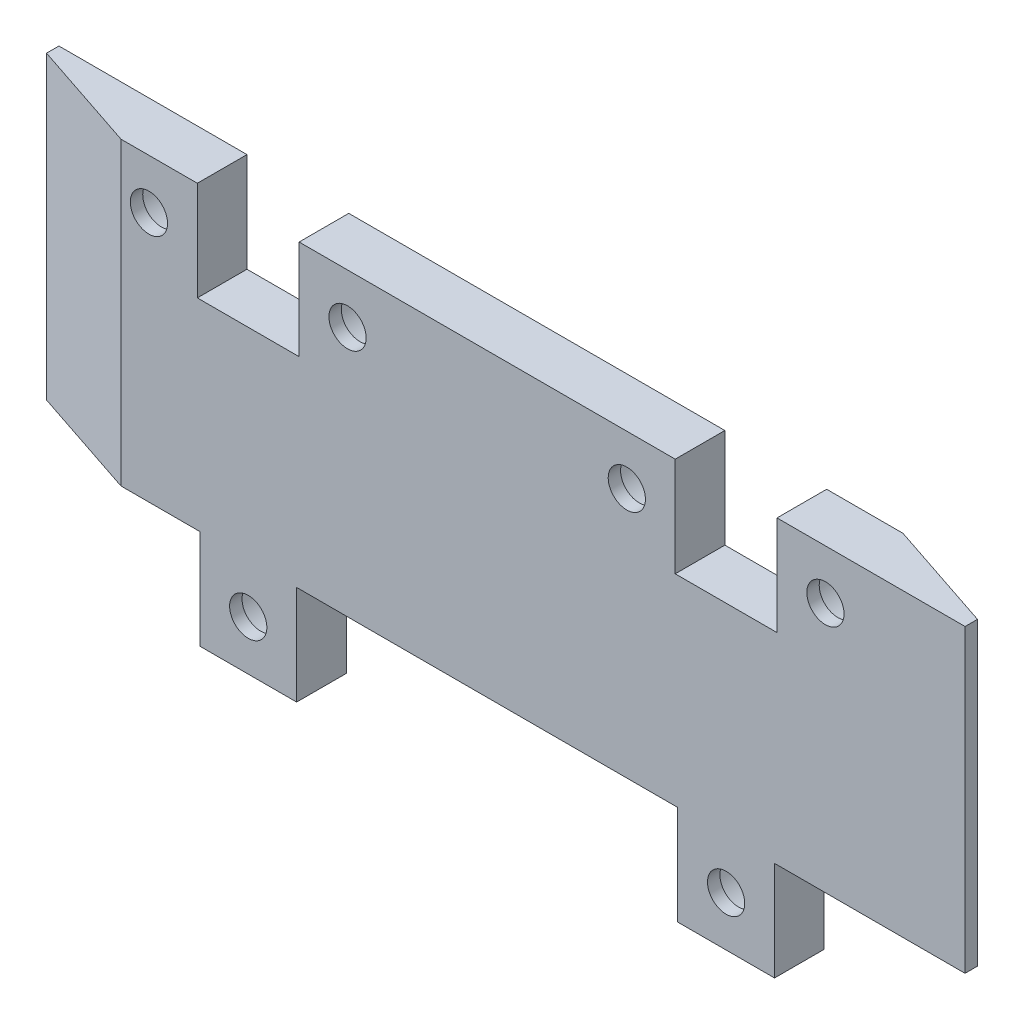
ISO-10303-21;
HEADER;
FILE_DESCRIPTION(('STEP AP214'),'2;1');
FILE_NAME('part.step','',(''),(''),'','','');
FILE_SCHEMA(('AUTOMOTIVE_DESIGN { 1 0 10303 214 1 1 1 1 }'));
ENDSEC;
DATA;
#1=APPLICATION_CONTEXT('core data for automotive mechanical design processes');
#2=APPLICATION_PROTOCOL_DEFINITION('international standard','automotive_design',2000,#1);
#3=PRODUCT_CONTEXT('',#1,'mechanical');
#4=PRODUCT('Part','Part','',(#3));
#5=PRODUCT_RELATED_PRODUCT_CATEGORY('part','',(#4));
#6=PRODUCT_DEFINITION_FORMATION('','',#4);
#7=PRODUCT_DEFINITION_CONTEXT('part definition',#1,'design');
#8=PRODUCT_DEFINITION('design','',#6,#7);
#9=PRODUCT_DEFINITION_SHAPE('','',#8);
#10=(LENGTH_UNIT() NAMED_UNIT(*) SI_UNIT(.MILLI.,.METRE.));
#11=(NAMED_UNIT(*) PLANE_ANGLE_UNIT() SI_UNIT($,.RADIAN.));
#12=(NAMED_UNIT(*) SI_UNIT($,.STERADIAN.) SOLID_ANGLE_UNIT());
#13=UNCERTAINTY_MEASURE_WITH_UNIT(LENGTH_MEASURE(1.E-05),#10,'distance_accuracy_value','');
#14=(GEOMETRIC_REPRESENTATION_CONTEXT(3) GLOBAL_UNCERTAINTY_ASSIGNED_CONTEXT((#13)) GLOBAL_UNIT_ASSIGNED_CONTEXT((#10,
#11,#12)) REPRESENTATION_CONTEXT('',''));
#15=CARTESIAN_POINT('',(0.,0.,0.));
#16=DIRECTION('',(0.,0.,1.));
#17=DIRECTION('',(1.,0.,0.));
#18=AXIS2_PLACEMENT_3D('',#15,#16,#17);
#19=CARTESIAN_POINT('',(-38.5,16.1,4.));
#20=DIRECTION('',(0.,-1.,0.));
#21=DIRECTION('',(0.,0.,-1.));
#22=AXIS2_PLACEMENT_3D('',#19,#20,#21);
#23=PLANE('',#22);
#24=DIRECTION('',(0.,0.,-1.));
#25=VECTOR('',#24,1.);
#26=CARTESIAN_POINT('',(15.15,16.1,10.));
#27=LINE('',#26,#25);
#28=CARTESIAN_POINT('',(15.15,16.1,4.));
#29=VERTEX_POINT('',#28);
#30=CARTESIAN_POINT('',(15.15,16.1,0.));
#31=VERTEX_POINT('',#30);
#32=EDGE_CURVE('E528',#29,#31,#27,.T.);
#33=ORIENTED_EDGE('',*,*,#32,.T.);
#34=DIRECTION('',(-1.,0.,0.));
#35=VECTOR('',#34,1.);
#36=CARTESIAN_POINT('',(-38.5,16.1,0.));
#37=LINE('',#36,#35);
#38=CARTESIAN_POINT('',(-15.15,16.1,0.));
#39=VERTEX_POINT('',#38);
#40=EDGE_CURVE('E476',#31,#39,#37,.T.);
#41=ORIENTED_EDGE('',*,*,#40,.T.);
#42=DIRECTION('',(0.,0.,-1.));
#43=VECTOR('',#42,1.);
#44=CARTESIAN_POINT('',(-15.15,16.0999999999999,10.));
#45=LINE('',#44,#43);
#46=CARTESIAN_POINT('',(-15.15,16.0999999999999,4.));
#47=VERTEX_POINT('',#46);
#48=EDGE_CURVE('E331',#47,#39,#45,.T.);
#49=ORIENTED_EDGE('',*,*,#48,.F.);
#50=DIRECTION('',(-1.,0.,0.));
#51=VECTOR('',#50,1.);
#52=CARTESIAN_POINT('',(-38.5,16.1,4.));
#53=LINE('',#52,#51);
#54=EDGE_CURVE('E468',#29,#47,#53,.T.);
#55=ORIENTED_EDGE('',*,*,#54,.F.);
#56=EDGE_LOOP('',(#33,#41,#49,#55));
#57=FACE_BOUND('',#56,.T.);
#58=ADVANCED_FACE('F43',(#57),#23,.F.);
#59=DIRECTION('',(0.,0.,-1.));
#60=VECTOR('',#59,1.);
#61=CARTESIAN_POINT('',(38.5,16.1,4.));
#62=LINE('',#61,#60);
#63=CARTESIAN_POINT('',(38.5,16.1,4.));
#64=VERTEX_POINT('',#63);
#65=CARTESIAN_POINT('',(38.5,16.1,3.));
#66=VERTEX_POINT('',#65);
#67=EDGE_CURVE('E210',#64,#66,#62,.T.);
#68=ORIENTED_EDGE('',*,*,#67,.T.);
#69=DIRECTION('',(0.948683298050514,0.,0.316227766016838));
#70=VECTOR('',#69,1.);
#71=CARTESIAN_POINT('',(38.5,16.1,3.));
#72=LINE('',#71,#70);
#73=CARTESIAN_POINT('',(29.5,16.1,0.));
#74=VERTEX_POINT('',#73);
#75=EDGE_CURVE('E196',#74,#66,#72,.T.);
#76=ORIENTED_EDGE('',*,*,#75,.F.);
#77=CARTESIAN_POINT('',(23.35,16.1,0.));
#78=VERTEX_POINT('',#77);
#79=EDGE_CURVE('E472',#74,#78,#37,.T.);
#80=ORIENTED_EDGE('',*,*,#79,.T.);
#81=DIRECTION('',(0.,0.,-1.));
#82=VECTOR('',#81,1.);
#83=CARTESIAN_POINT('',(23.35,16.1,10.));
#84=LINE('',#83,#82);
#85=CARTESIAN_POINT('',(23.35,16.1,4.));
#86=VERTEX_POINT('',#85);
#87=EDGE_CURVE('E524',#86,#78,#84,.T.);
#88=ORIENTED_EDGE('',*,*,#87,.F.);
#89=EDGE_CURVE('E218',#64,#86,#53,.T.);
#90=ORIENTED_EDGE('',*,*,#89,.F.);
#91=EDGE_LOOP('',(#68,#76,#80,#88,#90));
#92=FACE_BOUND('',#91,.T.);
#93=ADVANCED_FACE('F215',(#92),#23,.F.);
#94=CARTESIAN_POINT('',(-38.5,-16.1,4.));
#95=DIRECTION('',(0.,1.,0.));
#96=DIRECTION('',(0.,0.,1.));
#97=AXIS2_PLACEMENT_3D('',#94,#95,#96);
#98=PLANE('',#97);
#99=DIRECTION('',(0.,0.,-1.));
#100=VECTOR('',#99,1.);
#101=CARTESIAN_POINT('',(15.35,-16.0999999999999,10.));
#102=LINE('',#101,#100);
#103=CARTESIAN_POINT('',(15.35,-16.0999999999999,4.));
#104=VERTEX_POINT('',#103);
#105=CARTESIAN_POINT('',(15.35,-16.0999999999999,0.));
#106=VERTEX_POINT('',#105);
#107=EDGE_CURVE('E511',#104,#106,#102,.T.);
#108=ORIENTED_EDGE('',*,*,#107,.T.);
#109=DIRECTION('',(1.,0.,0.));
#110=VECTOR('',#109,1.);
#111=CARTESIAN_POINT('',(-38.5,-16.1,0.));
#112=LINE('',#111,#110);
#113=CARTESIAN_POINT('',(23.15,-16.0999999999999,0.));
#114=VERTEX_POINT('',#113);
#115=EDGE_CURVE('E479',#106,#114,#112,.T.);
#116=ORIENTED_EDGE('',*,*,#115,.T.);
#117=DIRECTION('',(0.,0.,-1.));
#118=VECTOR('',#117,1.);
#119=CARTESIAN_POINT('',(23.15,-16.0999999999999,10.));
#120=LINE('',#119,#118);
#121=CARTESIAN_POINT('',(23.15,-16.0999999999999,4.));
#122=VERTEX_POINT('',#121);
#123=EDGE_CURVE('E285',#122,#114,#120,.T.);
#124=ORIENTED_EDGE('',*,*,#123,.F.);
#125=DIRECTION('',(1.,0.,0.));
#126=VECTOR('',#125,1.);
#127=CARTESIAN_POINT('',(-38.5,-16.1,4.));
#128=LINE('',#127,#126);
#129=EDGE_CURVE('E467',#104,#122,#128,.T.);
#130=ORIENTED_EDGE('',*,*,#129,.F.);
#131=EDGE_LOOP('',(#108,#116,#124,#130));
#132=FACE_BOUND('',#131,.T.);
#133=ADVANCED_FACE('F608',(#132),#98,.F.);
#134=CARTESIAN_POINT('',(0.,0.,4.));
#135=DIRECTION('',(0.,0.,-1.));
#136=DIRECTION('',(-1.,0.,0.));
#137=AXIS2_PLACEMENT_3D('',#134,#135,#136);
#138=PLANE('',#137);
#139=CARTESIAN_POINT('',(19.25,-12.1,4.));
#140=DIRECTION('',(0.,0.,-1.));
#141=DIRECTION('',(-1.,0.,0.));
#142=AXIS2_PLACEMENT_3D('',#139,#140,#141);
#143=CIRCLE('',#142,1.5);
#144=CARTESIAN_POINT('',(17.75,-12.1,4.));
#145=VERTEX_POINT('',#144);
#146=EDGE_CURVE('E410',#145,#145,#143,.T.);
#147=ORIENTED_EDGE('',*,*,#146,.T.);
#148=EDGE_LOOP('',(#147));
#149=FACE_BOUND('',#148,.T.);
#150=CARTESIAN_POINT('',(-19.25,-12.1,4.));
#151=DIRECTION('',(0.,0.,-1.));
#152=DIRECTION('',(-1.,0.,0.));
#153=AXIS2_PLACEMENT_3D('',#150,#151,#152);
#154=CIRCLE('',#153,1.5);
#155=CARTESIAN_POINT('',(-20.75,-12.1,4.));
#156=VERTEX_POINT('',#155);
#157=EDGE_CURVE('E257',#156,#156,#154,.T.);
#158=ORIENTED_EDGE('',*,*,#157,.T.);
#159=EDGE_LOOP('',(#158));
#160=FACE_BOUND('',#159,.T.);
#161=CARTESIAN_POINT('',(-11.25,12.1,4.));
#162=DIRECTION('',(0.,0.,-1.));
#163=DIRECTION('',(-1.,0.,0.));
#164=AXIS2_PLACEMENT_3D('',#161,#162,#163);
#165=CIRCLE('',#164,1.5);
#166=CARTESIAN_POINT('',(-12.75,12.1,4.));
#167=VERTEX_POINT('',#166);
#168=EDGE_CURVE('E432',#167,#167,#165,.T.);
#169=ORIENTED_EDGE('',*,*,#168,.T.);
#170=EDGE_LOOP('',(#169));
#171=FACE_BOUND('',#170,.T.);
#172=CARTESIAN_POINT('',(-27.25,12.1,4.));
#173=DIRECTION('',(0.,0.,-1.));
#174=DIRECTION('',(-1.,0.,0.));
#175=AXIS2_PLACEMENT_3D('',#172,#173,#174);
#176=CIRCLE('',#175,1.5);
#177=CARTESIAN_POINT('',(-28.75,12.1,4.));
#178=VERTEX_POINT('',#177);
#179=EDGE_CURVE('E248',#178,#178,#176,.T.);
#180=ORIENTED_EDGE('',*,*,#179,.T.);
#181=EDGE_LOOP('',(#180));
#182=FACE_BOUND('',#181,.T.);
#183=CARTESIAN_POINT('',(27.25,12.1,4.));
#184=DIRECTION('',(0.,0.,-1.));
#185=DIRECTION('',(-1.,0.,0.));
#186=AXIS2_PLACEMENT_3D('',#183,#184,#185);
#187=CIRCLE('',#186,1.5);
#188=CARTESIAN_POINT('',(25.75,12.1,4.));
#189=VERTEX_POINT('',#188);
#190=EDGE_CURVE('E452',#189,#189,#187,.T.);
#191=ORIENTED_EDGE('',*,*,#190,.T.);
#192=EDGE_LOOP('',(#191));
#193=FACE_BOUND('',#192,.T.);
#194=CARTESIAN_POINT('',(11.25,12.1,4.));
#195=DIRECTION('',(0.,0.,-1.));
#196=DIRECTION('',(-1.,0.,0.));
#197=AXIS2_PLACEMENT_3D('',#194,#195,#196);
#198=CIRCLE('',#197,1.5);
#199=CARTESIAN_POINT('',(9.74999999999999,12.1,4.));
#200=VERTEX_POINT('',#199);
#201=EDGE_CURVE('E238',#200,#200,#198,.T.);
#202=ORIENTED_EDGE('',*,*,#201,.T.);
#203=EDGE_LOOP('',(#202));
#204=FACE_BOUND('',#203,.T.);
#205=CARTESIAN_POINT('',(-23.35,16.0999999999999,4.));
#206=VERTEX_POINT('',#205);
#207=CARTESIAN_POINT('',(-29.5,16.1,4.));
#208=VERTEX_POINT('',#207);
#209=EDGE_CURVE('E463',#206,#208,#53,.T.);
#210=ORIENTED_EDGE('',*,*,#209,.T.);
#211=DIRECTION('',(0.,1.,0.));
#212=VECTOR('',#211,1.);
#213=CARTESIAN_POINT('',(-29.5,-16.1,4.));
#214=LINE('',#213,#212);
#215=CARTESIAN_POINT('',(-29.5,-8.1,4.));
#216=VERTEX_POINT('',#215);
#217=EDGE_CURVE('E547',#216,#208,#214,.T.);
#218=ORIENTED_EDGE('',*,*,#217,.F.);
#219=DIRECTION('',(-1.,0.,0.));
#220=VECTOR('',#219,1.);
#221=CARTESIAN_POINT('',(0.,-8.1,4.));
#222=LINE('',#221,#220);
#223=CARTESIAN_POINT('',(-23.15,-8.1,4.));
#224=VERTEX_POINT('',#223);
#225=EDGE_CURVE('E378',#224,#216,#222,.T.);
#226=ORIENTED_EDGE('',*,*,#225,.F.);
#227=DIRECTION('',(0.,1.,0.));
#228=VECTOR('',#227,1.);
#229=CARTESIAN_POINT('',(-23.15,0.,4.));
#230=LINE('',#229,#228);
#231=CARTESIAN_POINT('',(-23.15,-16.1,4.));
#232=VERTEX_POINT('',#231);
#233=EDGE_CURVE('E382',#232,#224,#230,.T.);
#234=ORIENTED_EDGE('',*,*,#233,.F.);
#235=CARTESIAN_POINT('',(-15.35,-16.1,4.));
#236=VERTEX_POINT('',#235);
#237=EDGE_CURVE('E225',#232,#236,#128,.T.);
#238=ORIENTED_EDGE('',*,*,#237,.T.);
#239=DIRECTION('',(0.,-1.,0.));
#240=VECTOR('',#239,1.);
#241=CARTESIAN_POINT('',(-15.35,0.,4.));
#242=LINE('',#241,#240);
#243=CARTESIAN_POINT('',(-15.35,-8.1,4.));
#244=VERTEX_POINT('',#243);
#245=EDGE_CURVE('E375',#244,#236,#242,.T.);
#246=ORIENTED_EDGE('',*,*,#245,.F.);
#247=DIRECTION('',(-1.,0.,0.));
#248=VECTOR('',#247,1.);
#249=CARTESIAN_POINT('',(0.,-8.1,4.));
#250=LINE('',#249,#248);
#251=CARTESIAN_POINT('',(15.35,-8.09999999999993,4.));
#252=VERTEX_POINT('',#251);
#253=EDGE_CURVE('E341',#252,#244,#250,.T.);
#254=ORIENTED_EDGE('',*,*,#253,.F.);
#255=DIRECTION('',(0.,1.,0.));
#256=VECTOR('',#255,1.);
#257=CARTESIAN_POINT('',(15.35,0.,4.));
#258=LINE('',#257,#256);
#259=EDGE_CURVE('E300',#104,#252,#258,.T.);
#260=ORIENTED_EDGE('',*,*,#259,.F.);
#261=ORIENTED_EDGE('',*,*,#129,.T.);
#262=DIRECTION('',(0.,-1.,0.));
#263=VECTOR('',#262,1.);
#264=CARTESIAN_POINT('',(23.15,0.,4.));
#265=LINE('',#264,#263);
#266=CARTESIAN_POINT('',(23.15,-8.09999999999993,4.));
#267=VERTEX_POINT('',#266);
#268=EDGE_CURVE('E296',#267,#122,#265,.T.);
#269=ORIENTED_EDGE('',*,*,#268,.F.);
#270=DIRECTION('',(-1.,0.,0.));
#271=VECTOR('',#270,1.);
#272=CARTESIAN_POINT('',(0.,-8.09999999999993,4.));
#273=LINE('',#272,#271);
#274=CARTESIAN_POINT('',(38.5,-8.09999999999993,4.));
#275=VERTEX_POINT('',#274);
#276=EDGE_CURVE('E293',#275,#267,#273,.T.);
#277=ORIENTED_EDGE('',*,*,#276,.F.);
#278=DIRECTION('',(0.,1.,0.));
#279=VECTOR('',#278,1.);
#280=CARTESIAN_POINT('',(38.5,-16.1,4.));
#281=LINE('',#280,#279);
#282=EDGE_CURVE('E460',#275,#64,#281,.T.);
#283=ORIENTED_EDGE('',*,*,#282,.T.);
#284=ORIENTED_EDGE('',*,*,#89,.T.);
#285=DIRECTION('',(0.,1.,0.));
#286=VECTOR('',#285,1.);
#287=CARTESIAN_POINT('',(23.35,0.,4.));
#288=LINE('',#287,#286);
#289=CARTESIAN_POINT('',(23.35,8.09999999999997,4.));
#290=VERTEX_POINT('',#289);
#291=EDGE_CURVE('E304',#290,#86,#288,.T.);
#292=ORIENTED_EDGE('',*,*,#291,.F.);
#293=DIRECTION('',(1.,0.,0.));
#294=VECTOR('',#293,1.);
#295=CARTESIAN_POINT('',(0.,8.09999999999997,4.));
#296=LINE('',#295,#294);
#297=CARTESIAN_POINT('',(15.15,8.09999999999997,4.));
#298=VERTEX_POINT('',#297);
#299=EDGE_CURVE('E307',#298,#290,#296,.T.);
#300=ORIENTED_EDGE('',*,*,#299,.F.);
#301=DIRECTION('',(0.,-1.,0.));
#302=VECTOR('',#301,1.);
#303=CARTESIAN_POINT('',(15.15,0.,4.));
#304=LINE('',#303,#302);
#305=EDGE_CURVE('E310',#29,#298,#304,.T.);
#306=ORIENTED_EDGE('',*,*,#305,.F.);
#307=ORIENTED_EDGE('',*,*,#54,.T.);
#308=DIRECTION('',(0.,1.,0.));
#309=VECTOR('',#308,1.);
#310=CARTESIAN_POINT('',(-15.15,0.,4.));
#311=LINE('',#310,#309);
#312=CARTESIAN_POINT('',(-15.15,8.09999999999989,4.));
#313=VERTEX_POINT('',#312);
#314=EDGE_CURVE('E385',#313,#47,#311,.T.);
#315=ORIENTED_EDGE('',*,*,#314,.F.);
#316=DIRECTION('',(1.,0.,0.));
#317=VECTOR('',#316,1.);
#318=CARTESIAN_POINT('',(0.,8.09999999999989,4.));
#319=LINE('',#318,#317);
#320=CARTESIAN_POINT('',(-23.35,8.09999999999989,4.));
#321=VERTEX_POINT('',#320);
#322=EDGE_CURVE('E389',#321,#313,#319,.T.);
#323=ORIENTED_EDGE('',*,*,#322,.F.);
#324=DIRECTION('',(0.,-1.,0.));
#325=VECTOR('',#324,1.);
#326=CARTESIAN_POINT('',(-23.35,0.,4.));
#327=LINE('',#326,#325);
#328=EDGE_CURVE('E392',#206,#321,#327,.T.);
#329=ORIENTED_EDGE('',*,*,#328,.F.);
#330=EDGE_LOOP('',(#210,#218,#226,#234,#238,#246,#254,#260,#261,#269,#277,#283,#284,#292,#300,
#306,#307,#315,#323,#329));
#331=FACE_BOUND('',#330,.T.);
#332=ADVANCED_FACE('F507',(#149,#160,#171,#182,#193,#204,#331),#138,.F.);
#333=CARTESIAN_POINT('',(0.,0.,0.));
#334=DIRECTION('',(0.,0.,-1.));
#335=DIRECTION('',(-1.,0.,0.));
#336=AXIS2_PLACEMENT_3D('',#333,#334,#335);
#337=PLANE('',#336);
#338=DIRECTION('',(0.,1.,0.));
#339=VECTOR('',#338,1.);
#340=CARTESIAN_POINT('',(29.5,-16.1,0.));
#341=LINE('',#340,#339);
#342=CARTESIAN_POINT('',(29.5,-8.09999999999993,0.));
#343=VERTEX_POINT('',#342);
#344=CARTESIAN_POINT('',(29.5,10.1156865167015,0.));
#345=VERTEX_POINT('',#344);
#346=EDGE_CURVE('E260',#343,#345,#341,.T.);
#347=ORIENTED_EDGE('',*,*,#346,.F.);
#348=DIRECTION('',(-1.,0.,0.));
#349=VECTOR('',#348,1.);
#350=CARTESIAN_POINT('',(23.15,-8.09999999999993,0.));
#351=LINE('',#350,#349);
#352=CARTESIAN_POINT('',(23.15,-8.09999999999993,0.));
#353=VERTEX_POINT('',#352);
#354=EDGE_CURVE('E269',#343,#353,#351,.T.);
#355=ORIENTED_EDGE('',*,*,#354,.T.);
#356=DIRECTION('',(0.,-1.,0.));
#357=VECTOR('',#356,1.);
#358=CARTESIAN_POINT('',(23.15,-16.0999999999999,0.));
#359=LINE('',#358,#357);
#360=EDGE_CURVE('E281',#353,#114,#359,.T.);
#361=ORIENTED_EDGE('',*,*,#360,.T.);
#362=ORIENTED_EDGE('',*,*,#115,.F.);
#363=DIRECTION('',(0.,1.,0.));
#364=VECTOR('',#363,1.);
#365=CARTESIAN_POINT('',(15.35,-16.0999999999999,0.));
#366=LINE('',#365,#364);
#367=CARTESIAN_POINT('',(15.35,-8.09999999999993,0.));
#368=VERTEX_POINT('',#367);
#369=EDGE_CURVE('E292',#106,#368,#366,.T.);
#370=ORIENTED_EDGE('',*,*,#369,.T.);
#371=DIRECTION('',(-1.,0.,0.));
#372=VECTOR('',#371,1.);
#373=CARTESIAN_POINT('',(-15.35,-8.1,0.));
#374=LINE('',#373,#372);
#375=CARTESIAN_POINT('',(-15.35,-8.1,0.));
#376=VERTEX_POINT('',#375);
#377=EDGE_CURVE('E366',#368,#376,#374,.T.);
#378=ORIENTED_EDGE('',*,*,#377,.T.);
#379=DIRECTION('',(0.,-1.,0.));
#380=VECTOR('',#379,1.);
#381=CARTESIAN_POINT('',(-15.35,-16.1,0.));
#382=LINE('',#381,#380);
#383=CARTESIAN_POINT('',(-15.35,-16.1,0.));
#384=VERTEX_POINT('',#383);
#385=EDGE_CURVE('E346',#376,#384,#382,.T.);
#386=ORIENTED_EDGE('',*,*,#385,.T.);
#387=CARTESIAN_POINT('',(-23.15,-16.1,0.));
#388=VERTEX_POINT('',#387);
#389=EDGE_CURVE('E464',#388,#384,#112,.T.);
#390=ORIENTED_EDGE('',*,*,#389,.F.);
#391=DIRECTION('',(0.,1.,0.));
#392=VECTOR('',#391,1.);
#393=CARTESIAN_POINT('',(-23.15,-16.1,0.));
#394=LINE('',#393,#392);
#395=CARTESIAN_POINT('',(-23.15,-8.1,0.));
#396=VERTEX_POINT('',#395);
#397=EDGE_CURVE('E319',#388,#396,#394,.T.);
#398=ORIENTED_EDGE('',*,*,#397,.T.);
#399=DIRECTION('',(-1.,0.,0.));
#400=VECTOR('',#399,1.);
#401=CARTESIAN_POINT('',(-23.15,-8.1,0.));
#402=LINE('',#401,#400);
#403=CARTESIAN_POINT('',(-38.5,-8.1,0.));
#404=VERTEX_POINT('',#403);
#405=EDGE_CURVE('E353',#396,#404,#402,.T.);
#406=ORIENTED_EDGE('',*,*,#405,.T.);
#407=DIRECTION('',(0.,-1.,0.));
#408=VECTOR('',#407,1.);
#409=CARTESIAN_POINT('',(-38.5,-16.1,0.));
#410=LINE('',#409,#408);
#411=CARTESIAN_POINT('',(-38.5,16.1,0.));
#412=VERTEX_POINT('',#411);
#413=EDGE_CURVE('E475',#412,#404,#410,.T.);
#414=ORIENTED_EDGE('',*,*,#413,.F.);
#415=CARTESIAN_POINT('',(-23.35,16.0999999999999,0.));
#416=VERTEX_POINT('',#415);
#417=EDGE_CURVE('E456',#416,#412,#37,.T.);
#418=ORIENTED_EDGE('',*,*,#417,.F.);
#419=DIRECTION('',(0.,-1.,0.));
#420=VECTOR('',#419,1.);
#421=CARTESIAN_POINT('',(-23.35,16.0999999999999,0.));
#422=LINE('',#421,#420);
#423=CARTESIAN_POINT('',(-23.35,8.09999999999989,0.));
#424=VERTEX_POINT('',#423);
#425=EDGE_CURVE('E314',#416,#424,#422,.T.);
#426=ORIENTED_EDGE('',*,*,#425,.T.);
#427=DIRECTION('',(1.,0.,0.));
#428=VECTOR('',#427,1.);
#429=CARTESIAN_POINT('',(-23.35,8.09999999999989,0.));
#430=LINE('',#429,#428);
#431=CARTESIAN_POINT('',(-15.15,8.09999999999989,0.));
#432=VERTEX_POINT('',#431);
#433=EDGE_CURVE('E318',#424,#432,#430,.T.);
#434=ORIENTED_EDGE('',*,*,#433,.T.);
#435=DIRECTION('',(0.,1.,0.));
#436=VECTOR('',#435,1.);
#437=CARTESIAN_POINT('',(-15.15,16.0999999999999,0.));
#438=LINE('',#437,#436);
#439=EDGE_CURVE('E323',#432,#39,#438,.T.);
#440=ORIENTED_EDGE('',*,*,#439,.T.);
#441=ORIENTED_EDGE('',*,*,#40,.F.);
#442=DIRECTION('',(0.,-1.,0.));
#443=VECTOR('',#442,1.);
#444=CARTESIAN_POINT('',(15.15,16.1,0.));
#445=LINE('',#444,#443);
#446=CARTESIAN_POINT('',(15.15,8.09999999999997,0.));
#447=VERTEX_POINT('',#446);
#448=EDGE_CURVE('E516',#31,#447,#445,.T.);
#449=ORIENTED_EDGE('',*,*,#448,.T.);
#450=DIRECTION('',(1.,0.,0.));
#451=VECTOR('',#450,1.);
#452=CARTESIAN_POINT('',(15.15,8.09999999999997,0.));
#453=LINE('',#452,#451);
#454=CARTESIAN_POINT('',(23.35,8.09999999999997,0.));
#455=VERTEX_POINT('',#454);
#456=EDGE_CURVE('E536',#447,#455,#453,.T.);
#457=ORIENTED_EDGE('',*,*,#456,.T.);
#458=DIRECTION('',(0.,1.,0.));
#459=VECTOR('',#458,1.);
#460=CARTESIAN_POINT('',(23.35,16.1,0.));
#461=LINE('',#460,#459);
#462=EDGE_CURVE('E532',#455,#78,#461,.T.);
#463=ORIENTED_EDGE('',*,*,#462,.T.);
#464=ORIENTED_EDGE('',*,*,#79,.F.);
#465=CARTESIAN_POINT('',(29.5,14.0843134832985,0.));
#466=VERTEX_POINT('',#465);
#467=EDGE_CURVE('E199',#466,#74,#341,.T.);
#468=ORIENTED_EDGE('',*,*,#467,.F.);
#469=CARTESIAN_POINT('',(27.25,12.1,0.));
#470=DIRECTION('',(0.,0.,-1.));
#471=DIRECTION('',(-1.,0.,0.));
#472=AXIS2_PLACEMENT_3D('',#469,#470,#471);
#473=CIRCLE('',#472,3.00000000000001);
#474=EDGE_CURVE('E272',#345,#466,#473,.T.);
#475=ORIENTED_EDGE('',*,*,#474,.F.);
#476=EDGE_LOOP('',(#347,#355,#361,#362,#370,#378,#386,#390,#398,#406,#414,#418,#426,#434,#440,
#441,#449,#457,#463,#464,#468,#475));
#477=FACE_BOUND('',#476,.T.);
#478=CARTESIAN_POINT('',(19.25,-12.1,0.));
#479=DIRECTION('',(0.,0.,-1.));
#480=DIRECTION('',(-1.,0.,0.));
#481=AXIS2_PLACEMENT_3D('',#478,#479,#480);
#482=CIRCLE('',#481,3.);
#483=CARTESIAN_POINT('',(16.25,-12.1,0.));
#484=VERTEX_POINT('',#483);
#485=EDGE_CURVE('E399',#484,#484,#482,.T.);
#486=ORIENTED_EDGE('',*,*,#485,.F.);
#487=EDGE_LOOP('',(#486));
#488=FACE_BOUND('',#487,.T.);
#489=CARTESIAN_POINT('',(-19.25,-12.1,0.));
#490=DIRECTION('',(0.,0.,-1.));
#491=DIRECTION('',(-1.,0.,0.));
#492=AXIS2_PLACEMENT_3D('',#489,#490,#491);
#493=CIRCLE('',#492,3.);
#494=CARTESIAN_POINT('',(-22.25,-12.1,0.));
#495=VERTEX_POINT('',#494);
#496=EDGE_CURVE('E395',#495,#495,#493,.T.);
#497=ORIENTED_EDGE('',*,*,#496,.F.);
#498=EDGE_LOOP('',(#497));
#499=FACE_BOUND('',#498,.T.);
#500=CARTESIAN_POINT('',(-11.25,12.1,0.));
#501=DIRECTION('',(0.,0.,-1.));
#502=DIRECTION('',(-1.,0.,0.));
#503=AXIS2_PLACEMENT_3D('',#500,#501,#502);
#504=CIRCLE('',#503,3.00000000000001);
#505=CARTESIAN_POINT('',(-14.25,12.1,0.));
#506=VERTEX_POINT('',#505);
#507=EDGE_CURVE('E421',#506,#506,#504,.T.);
#508=ORIENTED_EDGE('',*,*,#507,.F.);
#509=EDGE_LOOP('',(#508));
#510=FACE_BOUND('',#509,.T.);
#511=CARTESIAN_POINT('',(-27.25,12.1,0.));
#512=DIRECTION('',(0.,0.,-1.));
#513=DIRECTION('',(-1.,0.,0.));
#514=AXIS2_PLACEMENT_3D('',#511,#512,#513);
#515=CIRCLE('',#514,3.);
#516=CARTESIAN_POINT('',(-30.25,12.1,0.));
#517=VERTEX_POINT('',#516);
#518=EDGE_CURVE('E414',#517,#517,#515,.T.);
#519=ORIENTED_EDGE('',*,*,#518,.F.);
#520=EDGE_LOOP('',(#519));
#521=FACE_BOUND('',#520,.T.);
#522=CARTESIAN_POINT('',(11.25,12.1,0.));
#523=DIRECTION('',(0.,0.,-1.));
#524=DIRECTION('',(-1.,0.,0.));
#525=AXIS2_PLACEMENT_3D('',#522,#523,#524);
#526=CIRCLE('',#525,3.);
#527=CARTESIAN_POINT('',(8.25,12.1,0.));
#528=VERTEX_POINT('',#527);
#529=EDGE_CURVE('E445',#528,#528,#526,.T.);
#530=ORIENTED_EDGE('',*,*,#529,.F.);
#531=EDGE_LOOP('',(#530));
#532=FACE_BOUND('',#531,.T.);
#533=ADVANCED_FACE('F266',(#477,#488,#499,#510,#521,#532),#337,.T.);
#534=CARTESIAN_POINT('',(38.5,-16.1,4.));
#535=DIRECTION('',(-1.,0.,0.));
#536=DIRECTION('',(0.,0.,1.));
#537=AXIS2_PLACEMENT_3D('',#534,#535,#536);
#538=PLANE('',#537);
#539=DIRECTION('',(0.,0.,1.));
#540=VECTOR('',#539,1.);
#541=CARTESIAN_POINT('',(38.5,-8.09999999999993,4.));
#542=LINE('',#541,#540);
#543=CARTESIAN_POINT('',(38.5,-8.09999999999993,3.));
#544=VERTEX_POINT('',#543);
#545=EDGE_CURVE('E211',#544,#275,#542,.T.);
#546=ORIENTED_EDGE('',*,*,#545,.F.);
#547=DIRECTION('',(0.,1.,0.));
#548=VECTOR('',#547,1.);
#549=CARTESIAN_POINT('',(38.5,-16.1,3.));
#550=LINE('',#549,#548);
#551=EDGE_CURVE('E66',#544,#66,#550,.T.);
#552=ORIENTED_EDGE('',*,*,#551,.T.);
#553=ORIENTED_EDGE('',*,*,#67,.F.);
#554=ORIENTED_EDGE('',*,*,#282,.F.);
#555=EDGE_LOOP('',(#546,#552,#553,#554));
#556=FACE_BOUND('',#555,.T.);
#557=ADVANCED_FACE('F45',(#556),#538,.F.);
#558=DIRECTION('',(0.,0.,-1.));
#559=VECTOR('',#558,1.);
#560=CARTESIAN_POINT('',(-38.5,16.1,4.));
#561=LINE('',#560,#559);
#562=CARTESIAN_POINT('',(-38.5,16.1,1.));
#563=VERTEX_POINT('',#562);
#564=EDGE_CURVE('E220',#563,#412,#561,.T.);
#565=ORIENTED_EDGE('',*,*,#564,.F.);
#566=DIRECTION('',(-0.948683298050514,0.,-0.316227766016838));
#567=VECTOR('',#566,1.);
#568=CARTESIAN_POINT('',(-29.5,16.1,4.));
#569=LINE('',#568,#567);
#570=EDGE_CURVE('E204',#208,#563,#569,.T.);
#571=ORIENTED_EDGE('',*,*,#570,.F.);
#572=ORIENTED_EDGE('',*,*,#209,.F.);
#573=DIRECTION('',(0.,0.,-1.));
#574=VECTOR('',#573,1.);
#575=CARTESIAN_POINT('',(-23.35,16.0999999999999,10.));
#576=LINE('',#575,#574);
#577=EDGE_CURVE('E327',#206,#416,#576,.T.);
#578=ORIENTED_EDGE('',*,*,#577,.T.);
#579=ORIENTED_EDGE('',*,*,#417,.T.);
#580=EDGE_LOOP('',(#565,#571,#572,#578,#579));
#581=FACE_BOUND('',#580,.T.);
#582=ADVANCED_FACE('F559',(#581),#23,.F.);
#583=CARTESIAN_POINT('',(-38.5,-16.1,4.));
#584=DIRECTION('',(1.,0.,0.));
#585=DIRECTION('',(0.,0.,-1.));
#586=AXIS2_PLACEMENT_3D('',#583,#584,#585);
#587=PLANE('',#586);
#588=DIRECTION('',(0.,0.,-1.));
#589=VECTOR('',#588,1.);
#590=CARTESIAN_POINT('',(-38.5,-8.1,10.));
#591=LINE('',#590,#589);
#592=CARTESIAN_POINT('',(-38.5,-8.1,0.999999999999999));
#593=VERTEX_POINT('',#592);
#594=EDGE_CURVE('E345',#593,#404,#591,.T.);
#595=ORIENTED_EDGE('',*,*,#594,.F.);
#596=DIRECTION('',(0.,1.,0.));
#597=VECTOR('',#596,1.);
#598=CARTESIAN_POINT('',(-38.5,-16.1,1.));
#599=LINE('',#598,#597);
#600=EDGE_CURVE('E58',#593,#563,#599,.T.);
#601=ORIENTED_EDGE('',*,*,#600,.T.);
#602=ORIENTED_EDGE('',*,*,#564,.T.);
#603=ORIENTED_EDGE('',*,*,#413,.T.);
#604=EDGE_LOOP('',(#595,#601,#602,#603));
#605=FACE_BOUND('',#604,.T.);
#606=ADVANCED_FACE('F555',(#605),#587,.F.);
#607=DIRECTION('',(0.,0.,-1.));
#608=VECTOR('',#607,1.);
#609=CARTESIAN_POINT('',(-23.15,-16.1,10.));
#610=LINE('',#609,#608);
#611=EDGE_CURVE('E349',#232,#388,#610,.T.);
#612=ORIENTED_EDGE('',*,*,#611,.T.);
#613=ORIENTED_EDGE('',*,*,#389,.T.);
#614=DIRECTION('',(0.,0.,-1.));
#615=VECTOR('',#614,1.);
#616=CARTESIAN_POINT('',(-15.35,-16.1,10.));
#617=LINE('',#616,#615);
#618=EDGE_CURVE('E313',#236,#384,#617,.T.);
#619=ORIENTED_EDGE('',*,*,#618,.F.);
#620=ORIENTED_EDGE('',*,*,#237,.F.);
#621=EDGE_LOOP('',(#612,#613,#619,#620));
#622=FACE_BOUND('',#621,.T.);
#623=ADVANCED_FACE('F491',(#622),#98,.F.);
#624=CARTESIAN_POINT('',(-19.25,-12.1,4.));
#625=DIRECTION('',(0.,0.,-1.));
#626=DIRECTION('',(-1.,0.,0.));
#627=AXIS2_PLACEMENT_3D('',#624,#625,#626);
#628=CYLINDRICAL_SURFACE('',#627,1.5);
#629=ORIENTED_EDGE('',*,*,#157,.F.);
#630=EDGE_LOOP('',(#629));
#631=FACE_BOUND('',#630,.T.);
#632=CARTESIAN_POINT('',(-19.25,-12.1,3.));
#633=DIRECTION('',(0.,0.,-1.));
#634=DIRECTION('',(-1.,0.,0.));
#635=AXIS2_PLACEMENT_3D('',#632,#633,#634);
#636=CIRCLE('',#635,1.5);
#637=CARTESIAN_POINT('',(-20.75,-12.1,3.));
#638=VERTEX_POINT('',#637);
#639=EDGE_CURVE('E253',#638,#638,#636,.F.);
#640=ORIENTED_EDGE('',*,*,#639,.F.);
#641=EDGE_LOOP('',(#640));
#642=FACE_BOUND('',#641,.T.);
#643=ADVANCED_FACE('F627',(#631,#642),#628,.F.);
#644=CARTESIAN_POINT('',(19.25,-12.1,4.));
#645=DIRECTION('',(0.,0.,-1.));
#646=DIRECTION('',(-1.,0.,0.));
#647=AXIS2_PLACEMENT_3D('',#644,#645,#646);
#648=CYLINDRICAL_SURFACE('',#647,1.5);
#649=ORIENTED_EDGE('',*,*,#146,.F.);
#650=EDGE_LOOP('',(#649));
#651=FACE_BOUND('',#650,.T.);
#652=CARTESIAN_POINT('',(19.25,-12.1,3.));
#653=DIRECTION('',(0.,0.,-1.));
#654=DIRECTION('',(-1.,0.,0.));
#655=AXIS2_PLACEMENT_3D('',#652,#653,#654);
#656=CIRCLE('',#655,1.5);
#657=CARTESIAN_POINT('',(17.75,-12.1,3.));
#658=VERTEX_POINT('',#657);
#659=EDGE_CURVE('E249',#658,#658,#656,.F.);
#660=ORIENTED_EDGE('',*,*,#659,.F.);
#661=EDGE_LOOP('',(#660));
#662=FACE_BOUND('',#661,.T.);
#663=ADVANCED_FACE('F631',(#651,#662),#648,.F.);
#664=CARTESIAN_POINT('',(-27.25,12.1,4.));
#665=DIRECTION('',(0.,0.,-1.));
#666=DIRECTION('',(-1.,0.,0.));
#667=AXIS2_PLACEMENT_3D('',#664,#665,#666);
#668=CYLINDRICAL_SURFACE('',#667,1.5);
#669=ORIENTED_EDGE('',*,*,#179,.F.);
#670=EDGE_LOOP('',(#669));
#671=FACE_BOUND('',#670,.T.);
#672=CARTESIAN_POINT('',(-27.25,12.1,3.));
#673=DIRECTION('',(0.,0.,-1.));
#674=DIRECTION('',(-1.,0.,0.));
#675=AXIS2_PLACEMENT_3D('',#672,#673,#674);
#676=CIRCLE('',#675,1.5);
#677=CARTESIAN_POINT('',(-28.75,12.1,3.));
#678=VERTEX_POINT('',#677);
#679=EDGE_CURVE('E243',#678,#678,#676,.F.);
#680=ORIENTED_EDGE('',*,*,#679,.F.);
#681=EDGE_LOOP('',(#680));
#682=FACE_BOUND('',#681,.T.);
#683=ADVANCED_FACE('F903',(#671,#682),#668,.F.);
#684=CARTESIAN_POINT('',(-11.25,12.1,4.));
#685=DIRECTION('',(0.,0.,-1.));
#686=DIRECTION('',(-1.,0.,0.));
#687=AXIS2_PLACEMENT_3D('',#684,#685,#686);
#688=CYLINDRICAL_SURFACE('',#687,1.5);
#689=ORIENTED_EDGE('',*,*,#168,.F.);
#690=EDGE_LOOP('',(#689));
#691=FACE_BOUND('',#690,.T.);
#692=CARTESIAN_POINT('',(-11.25,12.1,3.));
#693=DIRECTION('',(0.,0.,-1.));
#694=DIRECTION('',(-1.,0.,0.));
#695=AXIS2_PLACEMENT_3D('',#692,#693,#694);
#696=CIRCLE('',#695,1.5);
#697=CARTESIAN_POINT('',(-12.75,12.1,3.));
#698=VERTEX_POINT('',#697);
#699=EDGE_CURVE('E239',#698,#698,#696,.F.);
#700=ORIENTED_EDGE('',*,*,#699,.F.);
#701=EDGE_LOOP('',(#700));
#702=FACE_BOUND('',#701,.T.);
#703=ADVANCED_FACE('F960',(#691,#702),#688,.F.);
#704=CARTESIAN_POINT('',(11.25,12.1,4.));
#705=DIRECTION('',(0.,0.,-1.));
#706=DIRECTION('',(-1.,0.,0.));
#707=AXIS2_PLACEMENT_3D('',#704,#705,#706);
#708=CYLINDRICAL_SURFACE('',#707,1.5);
#709=ORIENTED_EDGE('',*,*,#201,.F.);
#710=EDGE_LOOP('',(#709));
#711=FACE_BOUND('',#710,.T.);
#712=CARTESIAN_POINT('',(11.25,12.1,3.));
#713=DIRECTION('',(0.,0.,-1.));
#714=DIRECTION('',(-1.,0.,0.));
#715=AXIS2_PLACEMENT_3D('',#712,#713,#714);
#716=CIRCLE('',#715,1.5);
#717=CARTESIAN_POINT('',(9.74999999999999,12.1,3.));
#718=VERTEX_POINT('',#717);
#719=EDGE_CURVE('E233',#718,#718,#716,.F.);
#720=ORIENTED_EDGE('',*,*,#719,.F.);
#721=EDGE_LOOP('',(#720));
#722=FACE_BOUND('',#721,.T.);
#723=ADVANCED_FACE('F965',(#711,#722),#708,.F.);
#724=CARTESIAN_POINT('',(27.25,12.1,4.));
#725=DIRECTION('',(0.,0.,-1.));
#726=DIRECTION('',(-1.,0.,0.));
#727=AXIS2_PLACEMENT_3D('',#724,#725,#726);
#728=CYLINDRICAL_SURFACE('',#727,1.5);
#729=ORIENTED_EDGE('',*,*,#190,.F.);
#730=EDGE_LOOP('',(#729));
#731=FACE_BOUND('',#730,.T.);
#732=CARTESIAN_POINT('',(27.25,12.1,3.));
#733=DIRECTION('',(0.,0.,-1.));
#734=DIRECTION('',(-1.,0.,0.));
#735=AXIS2_PLACEMENT_3D('',#732,#733,#734);
#736=CIRCLE('',#735,1.5);
#737=CARTESIAN_POINT('',(25.75,12.1,3.));
#738=VERTEX_POINT('',#737);
#739=EDGE_CURVE('E229',#738,#738,#736,.F.);
#740=ORIENTED_EDGE('',*,*,#739,.F.);
#741=EDGE_LOOP('',(#740));
#742=FACE_BOUND('',#741,.T.);
#743=ADVANCED_FACE('F998',(#731,#742),#728,.F.);
#744=CARTESIAN_POINT('',(27.25,12.1,3.));
#745=DIRECTION('',(0.,0.,-1.));
#746=DIRECTION('',(-1.,0.,0.));
#747=AXIS2_PLACEMENT_3D('',#744,#745,#746);
#748=PLANE('',#747);
#749=CARTESIAN_POINT('',(27.25,12.1,3.));
#750=DIRECTION('',(0.,0.,-1.));
#751=DIRECTION('',(-1.,0.,0.));
#752=AXIS2_PLACEMENT_3D('',#749,#750,#751);
#753=CIRCLE('',#752,3.00000000000001);
#754=CARTESIAN_POINT('',(24.25,12.1,3.));
#755=VERTEX_POINT('',#754);
#756=EDGE_CURVE('E234',#755,#755,#753,.T.);
#757=ORIENTED_EDGE('',*,*,#756,.T.);
#758=EDGE_LOOP('',(#757));
#759=FACE_BOUND('',#758,.T.);
#760=ORIENTED_EDGE('',*,*,#739,.T.);
#761=EDGE_LOOP('',(#760));
#762=FACE_BOUND('',#761,.T.);
#763=ADVANCED_FACE('F682',(#759,#762),#748,.T.);
#764=CARTESIAN_POINT('',(27.25,12.1,3.));
#765=DIRECTION('',(0.,0.,-1.));
#766=DIRECTION('',(-1.,0.,0.));
#767=AXIS2_PLACEMENT_3D('',#764,#765,#766);
#768=CYLINDRICAL_SURFACE('',#767,3.00000000000001);
#769=ORIENTED_EDGE('',*,*,#756,.F.);
#770=EDGE_LOOP('',(#769));
#771=FACE_BOUND('',#770,.T.);
#772=ORIENTED_EDGE('',*,*,#474,.T.);
#773=CARTESIAN_POINT('',(27.25,12.1,-0.749999999999998));
#774=DIRECTION('',(-0.316227766016838,0.,0.948683298050514));
#775=DIRECTION('',(-0.948683298050514,0.,-0.316227766016838));
#776=AXIS2_PLACEMENT_3D('',#773,#774,#775);
#777=ELLIPSE('',#776,3.16227766016839,3.00000000000001);
#778=EDGE_CURVE('E274',#466,#345,#777,.F.);
#779=ORIENTED_EDGE('',*,*,#778,.T.);
#780=EDGE_LOOP('',(#772,#779));
#781=FACE_BOUND('',#780,.T.);
#782=ADVANCED_FACE('F676',(#771,#781),#768,.F.);
#783=CARTESIAN_POINT('',(11.25,12.1,3.));
#784=DIRECTION('',(0.,0.,-1.));
#785=DIRECTION('',(-1.,0.,0.));
#786=AXIS2_PLACEMENT_3D('',#783,#784,#785);
#787=PLANE('',#786);
#788=CARTESIAN_POINT('',(11.25,12.1,3.));
#789=DIRECTION('',(0.,0.,-1.));
#790=DIRECTION('',(-1.,0.,0.));
#791=AXIS2_PLACEMENT_3D('',#788,#789,#790);
#792=CIRCLE('',#791,3.);
#793=CARTESIAN_POINT('',(8.25,12.1,3.));
#794=VERTEX_POINT('',#793);
#795=EDGE_CURVE('E436',#794,#794,#792,.T.);
#796=ORIENTED_EDGE('',*,*,#795,.T.);
#797=EDGE_LOOP('',(#796));
#798=FACE_BOUND('',#797,.T.);
#799=ORIENTED_EDGE('',*,*,#719,.T.);
#800=EDGE_LOOP('',(#799));
#801=FACE_BOUND('',#800,.T.);
#802=ADVANCED_FACE('F681',(#798,#801),#787,.T.);
#803=CARTESIAN_POINT('',(11.25,12.1,3.));
#804=DIRECTION('',(0.,0.,-1.));
#805=DIRECTION('',(-1.,0.,0.));
#806=AXIS2_PLACEMENT_3D('',#803,#804,#805);
#807=CYLINDRICAL_SURFACE('',#806,3.);
#808=ORIENTED_EDGE('',*,*,#795,.F.);
#809=EDGE_LOOP('',(#808));
#810=FACE_BOUND('',#809,.T.);
#811=ORIENTED_EDGE('',*,*,#529,.T.);
#812=EDGE_LOOP('',(#811));
#813=FACE_BOUND('',#812,.T.);
#814=ADVANCED_FACE('F951',(#810,#813),#807,.F.);
#815=CARTESIAN_POINT('',(-11.25,12.1,3.));
#816=DIRECTION('',(0.,0.,-1.));
#817=DIRECTION('',(-1.,0.,0.));
#818=AXIS2_PLACEMENT_3D('',#815,#816,#817);
#819=PLANE('',#818);
#820=CARTESIAN_POINT('',(-11.25,12.1,3.));
#821=DIRECTION('',(0.,0.,-1.));
#822=DIRECTION('',(-1.,0.,0.));
#823=AXIS2_PLACEMENT_3D('',#820,#821,#822);
#824=CIRCLE('',#823,3.00000000000001);
#825=CARTESIAN_POINT('',(-14.25,12.1,3.));
#826=VERTEX_POINT('',#825);
#827=EDGE_CURVE('E244',#826,#826,#824,.T.);
#828=ORIENTED_EDGE('',*,*,#827,.T.);
#829=EDGE_LOOP('',(#828));
#830=FACE_BOUND('',#829,.T.);
#831=ORIENTED_EDGE('',*,*,#699,.T.);
#832=EDGE_LOOP('',(#831));
#833=FACE_BOUND('',#832,.T.);
#834=ADVANCED_FACE('F940',(#830,#833),#819,.T.);
#835=CARTESIAN_POINT('',(-11.25,12.1,3.));
#836=DIRECTION('',(0.,0.,-1.));
#837=DIRECTION('',(-1.,0.,0.));
#838=AXIS2_PLACEMENT_3D('',#835,#836,#837);
#839=CYLINDRICAL_SURFACE('',#838,3.00000000000001);
#840=ORIENTED_EDGE('',*,*,#827,.F.);
#841=EDGE_LOOP('',(#840));
#842=FACE_BOUND('',#841,.T.);
#843=ORIENTED_EDGE('',*,*,#507,.T.);
#844=EDGE_LOOP('',(#843));
#845=FACE_BOUND('',#844,.T.);
#846=ADVANCED_FACE('F929',(#842,#845),#839,.F.);
#847=CARTESIAN_POINT('',(-27.25,12.1,3.));
#848=DIRECTION('',(0.,0.,-1.));
#849=DIRECTION('',(-1.,0.,0.));
#850=AXIS2_PLACEMENT_3D('',#847,#848,#849);
#851=PLANE('',#850);
#852=CARTESIAN_POINT('',(-27.25,12.1,3.));
#853=DIRECTION('',(0.,0.,-1.));
#854=DIRECTION('',(-1.,0.,0.));
#855=AXIS2_PLACEMENT_3D('',#852,#853,#854);
#856=CIRCLE('',#855,3.);
#857=CARTESIAN_POINT('',(-30.25,12.1,3.));
#858=VERTEX_POINT('',#857);
#859=EDGE_CURVE('E425',#858,#858,#856,.T.);
#860=ORIENTED_EDGE('',*,*,#859,.T.);
#861=EDGE_LOOP('',(#860));
#862=FACE_BOUND('',#861,.T.);
#863=ORIENTED_EDGE('',*,*,#679,.T.);
#864=EDGE_LOOP('',(#863));
#865=FACE_BOUND('',#864,.T.);
#866=ADVANCED_FACE('F919',(#862,#865),#851,.T.);
#867=CARTESIAN_POINT('',(-27.25,12.1,3.));
#868=DIRECTION('',(0.,0.,-1.));
#869=DIRECTION('',(-1.,0.,0.));
#870=AXIS2_PLACEMENT_3D('',#867,#868,#869);
#871=CYLINDRICAL_SURFACE('',#870,3.);
#872=ORIENTED_EDGE('',*,*,#859,.F.);
#873=EDGE_LOOP('',(#872));
#874=FACE_BOUND('',#873,.T.);
#875=ORIENTED_EDGE('',*,*,#518,.T.);
#876=EDGE_LOOP('',(#875));
#877=FACE_BOUND('',#876,.T.);
#878=ADVANCED_FACE('F890',(#874,#877),#871,.F.);
#879=CARTESIAN_POINT('',(19.25,-12.1,3.));
#880=DIRECTION('',(0.,0.,-1.));
#881=DIRECTION('',(-1.,0.,0.));
#882=AXIS2_PLACEMENT_3D('',#879,#880,#881);
#883=PLANE('',#882);
#884=CARTESIAN_POINT('',(19.25,-12.1,3.));
#885=DIRECTION('',(0.,0.,-1.));
#886=DIRECTION('',(-1.,0.,0.));
#887=AXIS2_PLACEMENT_3D('',#884,#885,#886);
#888=CIRCLE('',#887,3.);
#889=CARTESIAN_POINT('',(16.25,-12.1,3.));
#890=VERTEX_POINT('',#889);
#891=EDGE_CURVE('E254',#890,#890,#888,.T.);
#892=ORIENTED_EDGE('',*,*,#891,.T.);
#893=EDGE_LOOP('',(#892));
#894=FACE_BOUND('',#893,.T.);
#895=ORIENTED_EDGE('',*,*,#659,.T.);
#896=EDGE_LOOP('',(#895));
#897=FACE_BOUND('',#896,.T.);
#898=ADVANCED_FACE('F879',(#894,#897),#883,.T.);
#899=CARTESIAN_POINT('',(19.25,-12.1,3.));
#900=DIRECTION('',(0.,0.,-1.));
#901=DIRECTION('',(-1.,0.,0.));
#902=AXIS2_PLACEMENT_3D('',#899,#900,#901);
#903=CYLINDRICAL_SURFACE('',#902,3.);
#904=ORIENTED_EDGE('',*,*,#891,.F.);
#905=EDGE_LOOP('',(#904));
#906=FACE_BOUND('',#905,.T.);
#907=ORIENTED_EDGE('',*,*,#485,.T.);
#908=EDGE_LOOP('',(#907));
#909=FACE_BOUND('',#908,.T.);
#910=ADVANCED_FACE('F868',(#906,#909),#903,.F.);
#911=CARTESIAN_POINT('',(-19.25,-12.1,3.));
#912=DIRECTION('',(0.,0.,-1.));
#913=DIRECTION('',(-1.,0.,0.));
#914=AXIS2_PLACEMENT_3D('',#911,#912,#913);
#915=PLANE('',#914);
#916=CARTESIAN_POINT('',(-19.25,-12.1,3.));
#917=DIRECTION('',(0.,0.,-1.));
#918=DIRECTION('',(-1.,0.,0.));
#919=AXIS2_PLACEMENT_3D('',#916,#917,#918);
#920=CIRCLE('',#919,3.);
#921=CARTESIAN_POINT('',(-22.25,-12.1,3.));
#922=VERTEX_POINT('',#921);
#923=EDGE_CURVE('E403',#922,#922,#920,.T.);
#924=ORIENTED_EDGE('',*,*,#923,.T.);
#925=EDGE_LOOP('',(#924));
#926=FACE_BOUND('',#925,.T.);
#927=ORIENTED_EDGE('',*,*,#639,.T.);
#928=EDGE_LOOP('',(#927));
#929=FACE_BOUND('',#928,.T.);
#930=ADVANCED_FACE('F857',(#926,#929),#915,.T.);
#931=CARTESIAN_POINT('',(-19.25,-12.1,3.));
#932=DIRECTION('',(0.,0.,-1.));
#933=DIRECTION('',(-1.,0.,0.));
#934=AXIS2_PLACEMENT_3D('',#931,#932,#933);
#935=CYLINDRICAL_SURFACE('',#934,3.);
#936=ORIENTED_EDGE('',*,*,#923,.F.);
#937=EDGE_LOOP('',(#936));
#938=FACE_BOUND('',#937,.T.);
#939=ORIENTED_EDGE('',*,*,#496,.T.);
#940=EDGE_LOOP('',(#939));
#941=FACE_BOUND('',#940,.T.);
#942=ADVANCED_FACE('F843',(#938,#941),#935,.F.);
#943=CARTESIAN_POINT('',(-15.35,-16.1,10.));
#944=DIRECTION('',(1.,0.,0.));
#945=DIRECTION('',(0.,1.,0.));
#946=AXIS2_PLACEMENT_3D('',#943,#944,#945);
#947=PLANE('',#946);
#948=ORIENTED_EDGE('',*,*,#245,.T.);
#949=ORIENTED_EDGE('',*,*,#618,.T.);
#950=ORIENTED_EDGE('',*,*,#385,.F.);
#951=DIRECTION('',(0.,0.,-1.));
#952=VECTOR('',#951,1.);
#953=CARTESIAN_POINT('',(-15.35,-8.1,10.));
#954=LINE('',#953,#952);
#955=EDGE_CURVE('E362',#244,#376,#954,.T.);
#956=ORIENTED_EDGE('',*,*,#955,.F.);
#957=EDGE_LOOP('',(#948,#949,#950,#956));
#958=FACE_BOUND('',#957,.T.);
#959=ADVANCED_FACE('F497',(#958),#947,.T.);
#960=CARTESIAN_POINT('',(-15.35,-8.1,10.));
#961=DIRECTION('',(0.,-1.,0.));
#962=DIRECTION('',(1.,0.,0.));
#963=AXIS2_PLACEMENT_3D('',#960,#961,#962);
#964=PLANE('',#963);
#965=ORIENTED_EDGE('',*,*,#253,.T.);
#966=ORIENTED_EDGE('',*,*,#955,.T.);
#967=ORIENTED_EDGE('',*,*,#377,.F.);
#968=DIRECTION('',(0.,0.,-1.));
#969=VECTOR('',#968,1.);
#970=CARTESIAN_POINT('',(15.35,-8.09999999999993,10.));
#971=LINE('',#970,#969);
#972=EDGE_CURVE('E503',#252,#368,#971,.T.);
#973=ORIENTED_EDGE('',*,*,#972,.F.);
#974=EDGE_LOOP('',(#965,#966,#967,#973));
#975=FACE_BOUND('',#974,.T.);
#976=ADVANCED_FACE('F500',(#975),#964,.T.);
#977=CARTESIAN_POINT('',(-23.15,-16.1,10.));
#978=DIRECTION('',(-1.,0.,0.));
#979=DIRECTION('',(0.,0.,1.));
#980=AXIS2_PLACEMENT_3D('',#977,#978,#979);
#981=PLANE('',#980);
#982=ORIENTED_EDGE('',*,*,#233,.T.);
#983=DIRECTION('',(0.,0.,-1.));
#984=VECTOR('',#983,1.);
#985=CARTESIAN_POINT('',(-23.15,-8.1,10.));
#986=LINE('',#985,#984);
#987=EDGE_CURVE('E342',#224,#396,#986,.T.);
#988=ORIENTED_EDGE('',*,*,#987,.T.);
#989=ORIENTED_EDGE('',*,*,#397,.F.);
#990=ORIENTED_EDGE('',*,*,#611,.F.);
#991=EDGE_LOOP('',(#982,#988,#989,#990));
#992=FACE_BOUND('',#991,.T.);
#993=ADVANCED_FACE('F601',(#992),#981,.T.);
#994=CARTESIAN_POINT('',(-23.15,-8.1,10.));
#995=DIRECTION('',(0.,-1.,0.));
#996=DIRECTION('',(1.,0.,0.));
#997=AXIS2_PLACEMENT_3D('',#994,#995,#996);
#998=PLANE('',#997);
#999=DIRECTION('',(0.948683298050514,0.,0.316227766016838));
#1000=VECTOR('',#999,1.);
#1001=CARTESIAN_POINT('',(-21.985,-8.1,6.505));
#1002=LINE('',#1001,#1000);
#1003=EDGE_CURVE('E11',#593,#216,#1002,.T.);
#1004=ORIENTED_EDGE('',*,*,#1003,.F.);
#1005=ORIENTED_EDGE('',*,*,#594,.T.);
#1006=ORIENTED_EDGE('',*,*,#405,.F.);
#1007=ORIENTED_EDGE('',*,*,#987,.F.);
#1008=ORIENTED_EDGE('',*,*,#225,.T.);
#1009=EDGE_LOOP('',(#1004,#1005,#1006,#1007,#1008));
#1010=FACE_BOUND('',#1009,.T.);
#1011=ADVANCED_FACE('F567',(#1010),#998,.T.);
#1012=CARTESIAN_POINT('',(-23.35,16.0999999999999,10.));
#1013=DIRECTION('',(1.,0.,0.));
#1014=DIRECTION('',(0.,0.,-1.));
#1015=AXIS2_PLACEMENT_3D('',#1012,#1013,#1014);
#1016=PLANE('',#1015);
#1017=ORIENTED_EDGE('',*,*,#328,.T.);
#1018=DIRECTION('',(0.,0.,-1.));
#1019=VECTOR('',#1018,1.);
#1020=CARTESIAN_POINT('',(-23.35,8.09999999999989,10.));
#1021=LINE('',#1020,#1019);
#1022=EDGE_CURVE('E338',#321,#424,#1021,.T.);
#1023=ORIENTED_EDGE('',*,*,#1022,.T.);
#1024=ORIENTED_EDGE('',*,*,#425,.F.);
#1025=ORIENTED_EDGE('',*,*,#577,.F.);
#1026=EDGE_LOOP('',(#1017,#1023,#1024,#1025));
#1027=FACE_BOUND('',#1026,.T.);
#1028=ADVANCED_FACE('F593',(#1027),#1016,.T.);
#1029=CARTESIAN_POINT('',(-23.35,8.09999999999989,10.));
#1030=DIRECTION('',(0.,1.,0.));
#1031=DIRECTION('',(0.,0.,1.));
#1032=AXIS2_PLACEMENT_3D('',#1029,#1030,#1031);
#1033=PLANE('',#1032);
#1034=ORIENTED_EDGE('',*,*,#322,.T.);
#1035=DIRECTION('',(0.,0.,-1.));
#1036=VECTOR('',#1035,1.);
#1037=CARTESIAN_POINT('',(-15.15,8.09999999999989,10.));
#1038=LINE('',#1037,#1036);
#1039=EDGE_CURVE('E335',#313,#432,#1038,.T.);
#1040=ORIENTED_EDGE('',*,*,#1039,.T.);
#1041=ORIENTED_EDGE('',*,*,#433,.F.);
#1042=ORIENTED_EDGE('',*,*,#1022,.F.);
#1043=EDGE_LOOP('',(#1034,#1040,#1041,#1042));
#1044=FACE_BOUND('',#1043,.T.);
#1045=ADVANCED_FACE('F591',(#1044),#1033,.T.);
#1046=CARTESIAN_POINT('',(-15.15,16.0999999999999,10.));
#1047=DIRECTION('',(-1.,0.,0.));
#1048=DIRECTION('',(0.,0.,1.));
#1049=AXIS2_PLACEMENT_3D('',#1046,#1047,#1048);
#1050=PLANE('',#1049);
#1051=ORIENTED_EDGE('',*,*,#314,.T.);
#1052=ORIENTED_EDGE('',*,*,#48,.T.);
#1053=ORIENTED_EDGE('',*,*,#439,.F.);
#1054=ORIENTED_EDGE('',*,*,#1039,.F.);
#1055=EDGE_LOOP('',(#1051,#1052,#1053,#1054));
#1056=FACE_BOUND('',#1055,.T.);
#1057=ADVANCED_FACE('F584',(#1056),#1050,.T.);
#1058=CARTESIAN_POINT('',(15.35,-16.0999999999999,10.));
#1059=DIRECTION('',(-1.,0.,0.));
#1060=DIRECTION('',(0.,0.,1.));
#1061=AXIS2_PLACEMENT_3D('',#1058,#1059,#1060);
#1062=PLANE('',#1061);
#1063=ORIENTED_EDGE('',*,*,#259,.T.);
#1064=ORIENTED_EDGE('',*,*,#972,.T.);
#1065=ORIENTED_EDGE('',*,*,#369,.F.);
#1066=ORIENTED_EDGE('',*,*,#107,.F.);
#1067=EDGE_LOOP('',(#1063,#1064,#1065,#1066));
#1068=FACE_BOUND('',#1067,.T.);
#1069=ADVANCED_FACE('F510',(#1068),#1062,.T.);
#1070=CARTESIAN_POINT('',(23.15,-16.0999999999999,10.));
#1071=DIRECTION('',(1.,0.,0.));
#1072=DIRECTION('',(0.,1.,0.));
#1073=AXIS2_PLACEMENT_3D('',#1070,#1071,#1072);
#1074=PLANE('',#1073);
#1075=ORIENTED_EDGE('',*,*,#268,.T.);
#1076=ORIENTED_EDGE('',*,*,#123,.T.);
#1077=ORIENTED_EDGE('',*,*,#360,.F.);
#1078=DIRECTION('',(0.,0.,-1.));
#1079=VECTOR('',#1078,1.);
#1080=CARTESIAN_POINT('',(23.15,-8.09999999999993,10.));
#1081=LINE('',#1080,#1079);
#1082=EDGE_CURVE('E278',#267,#353,#1081,.T.);
#1083=ORIENTED_EDGE('',*,*,#1082,.F.);
#1084=EDGE_LOOP('',(#1075,#1076,#1077,#1083));
#1085=FACE_BOUND('',#1084,.T.);
#1086=ADVANCED_FACE('F708',(#1085),#1074,.T.);
#1087=CARTESIAN_POINT('',(23.15,-8.09999999999993,10.));
#1088=DIRECTION('',(0.,-1.,0.));
#1089=DIRECTION('',(1.,0.,0.));
#1090=AXIS2_PLACEMENT_3D('',#1087,#1088,#1089);
#1091=PLANE('',#1090);
#1092=DIRECTION('',(-0.948683298050514,0.,-0.316227766016838));
#1093=VECTOR('',#1092,1.);
#1094=CARTESIAN_POINT('',(26.785,-8.09999999999993,-0.905));
#1095=LINE('',#1094,#1093);
#1096=EDGE_CURVE('E52',#544,#343,#1095,.T.);
#1097=ORIENTED_EDGE('',*,*,#1096,.F.);
#1098=ORIENTED_EDGE('',*,*,#545,.T.);
#1099=ORIENTED_EDGE('',*,*,#276,.T.);
#1100=ORIENTED_EDGE('',*,*,#1082,.T.);
#1101=ORIENTED_EDGE('',*,*,#354,.F.);
#1102=EDGE_LOOP('',(#1097,#1098,#1099,#1100,#1101));
#1103=FACE_BOUND('',#1102,.T.);
#1104=ADVANCED_FACE('F276',(#1103),#1091,.T.);
#1105=CARTESIAN_POINT('',(15.15,16.1,10.));
#1106=DIRECTION('',(1.,0.,0.));
#1107=DIRECTION('',(0.,0.,-1.));
#1108=AXIS2_PLACEMENT_3D('',#1105,#1106,#1107);
#1109=PLANE('',#1108);
#1110=ORIENTED_EDGE('',*,*,#305,.T.);
#1111=DIRECTION('',(0.,0.,-1.));
#1112=VECTOR('',#1111,1.);
#1113=CARTESIAN_POINT('',(15.15,8.09999999999997,10.));
#1114=LINE('',#1113,#1112);
#1115=EDGE_CURVE('E297',#298,#447,#1114,.T.);
#1116=ORIENTED_EDGE('',*,*,#1115,.T.);
#1117=ORIENTED_EDGE('',*,*,#448,.F.);
#1118=ORIENTED_EDGE('',*,*,#32,.F.);
#1119=EDGE_LOOP('',(#1110,#1116,#1117,#1118));
#1120=FACE_BOUND('',#1119,.T.);
#1121=ADVANCED_FACE('F707',(#1120),#1109,.T.);
#1122=CARTESIAN_POINT('',(15.15,8.09999999999997,10.));
#1123=DIRECTION('',(0.,1.,0.));
#1124=DIRECTION('',(0.,0.,1.));
#1125=AXIS2_PLACEMENT_3D('',#1122,#1123,#1124);
#1126=PLANE('',#1125);
#1127=ORIENTED_EDGE('',*,*,#299,.T.);
#1128=DIRECTION('',(0.,0.,-1.));
#1129=VECTOR('',#1128,1.);
#1130=CARTESIAN_POINT('',(23.35,8.09999999999997,10.));
#1131=LINE('',#1130,#1129);
#1132=EDGE_CURVE('E521',#290,#455,#1131,.T.);
#1133=ORIENTED_EDGE('',*,*,#1132,.T.);
#1134=ORIENTED_EDGE('',*,*,#456,.F.);
#1135=ORIENTED_EDGE('',*,*,#1115,.F.);
#1136=EDGE_LOOP('',(#1127,#1133,#1134,#1135));
#1137=FACE_BOUND('',#1136,.T.);
#1138=ADVANCED_FACE('F743',(#1137),#1126,.T.);
#1139=CARTESIAN_POINT('',(23.35,16.1,10.));
#1140=DIRECTION('',(-1.,0.,0.));
#1141=DIRECTION('',(0.,0.,1.));
#1142=AXIS2_PLACEMENT_3D('',#1139,#1140,#1141);
#1143=PLANE('',#1142);
#1144=ORIENTED_EDGE('',*,*,#291,.T.);
#1145=ORIENTED_EDGE('',*,*,#87,.T.);
#1146=ORIENTED_EDGE('',*,*,#462,.F.);
#1147=ORIENTED_EDGE('',*,*,#1132,.F.);
#1148=EDGE_LOOP('',(#1144,#1145,#1146,#1147));
#1149=FACE_BOUND('',#1148,.T.);
#1150=ADVANCED_FACE('F722',(#1149),#1143,.T.);
#1151=CARTESIAN_POINT('',(38.5,-16.1,3.));
#1152=DIRECTION('',(-0.316227766016838,0.,0.948683298050514));
#1153=DIRECTION('',(0.948683298050514,0.,0.316227766016838));
#1154=AXIS2_PLACEMENT_3D('',#1151,#1152,#1153);
#1155=PLANE('',#1154);
#1156=ORIENTED_EDGE('',*,*,#467,.T.);
#1157=ORIENTED_EDGE('',*,*,#75,.T.);
#1158=ORIENTED_EDGE('',*,*,#551,.F.);
#1159=ORIENTED_EDGE('',*,*,#1096,.T.);
#1160=ORIENTED_EDGE('',*,*,#346,.T.);
#1161=ORIENTED_EDGE('',*,*,#778,.F.);
#1162=EDGE_LOOP('',(#1156,#1157,#1158,#1159,#1160,#1161));
#1163=FACE_BOUND('',#1162,.T.);
#1164=ADVANCED_FACE('F197',(#1163),#1155,.F.);
#1165=CARTESIAN_POINT('',(-29.5,-16.1,4.));
#1166=DIRECTION('',(0.316227766016838,0.,-0.948683298050514));
#1167=DIRECTION('',(-0.948683298050514,0.,-0.316227766016838));
#1168=AXIS2_PLACEMENT_3D('',#1165,#1166,#1167);
#1169=PLANE('',#1168);
#1170=ORIENTED_EDGE('',*,*,#1003,.T.);
#1171=ORIENTED_EDGE('',*,*,#217,.T.);
#1172=ORIENTED_EDGE('',*,*,#570,.T.);
#1173=ORIENTED_EDGE('',*,*,#600,.F.);
#1174=EDGE_LOOP('',(#1170,#1171,#1172,#1173));
#1175=FACE_BOUND('',#1174,.T.);
#1176=ADVANCED_FACE('F570',(#1175),#1169,.F.);
#1177=CLOSED_SHELL('',(#58,#93,#133,#332,#533,#557,#582,#606,#623,#643,#663,#683,#703,#723,#743,
#763,#782,#802,#814,#834,#846,#866,#878,#898,#910,#930,#942,#959,#976,#993,#1011,#1028,#1045,
#1057,#1069,#1086,#1104,#1121,#1138,#1150,#1164,#1176));
#1178=MANIFOLD_SOLID_BREP('B2',#1177);
#1179=ADVANCED_BREP_SHAPE_REPRESENTATION('',(#18,#1178),#14);
#1180=SHAPE_DEFINITION_REPRESENTATION(#9,#1179);
ENDSEC;
END-ISO-10303-21;
